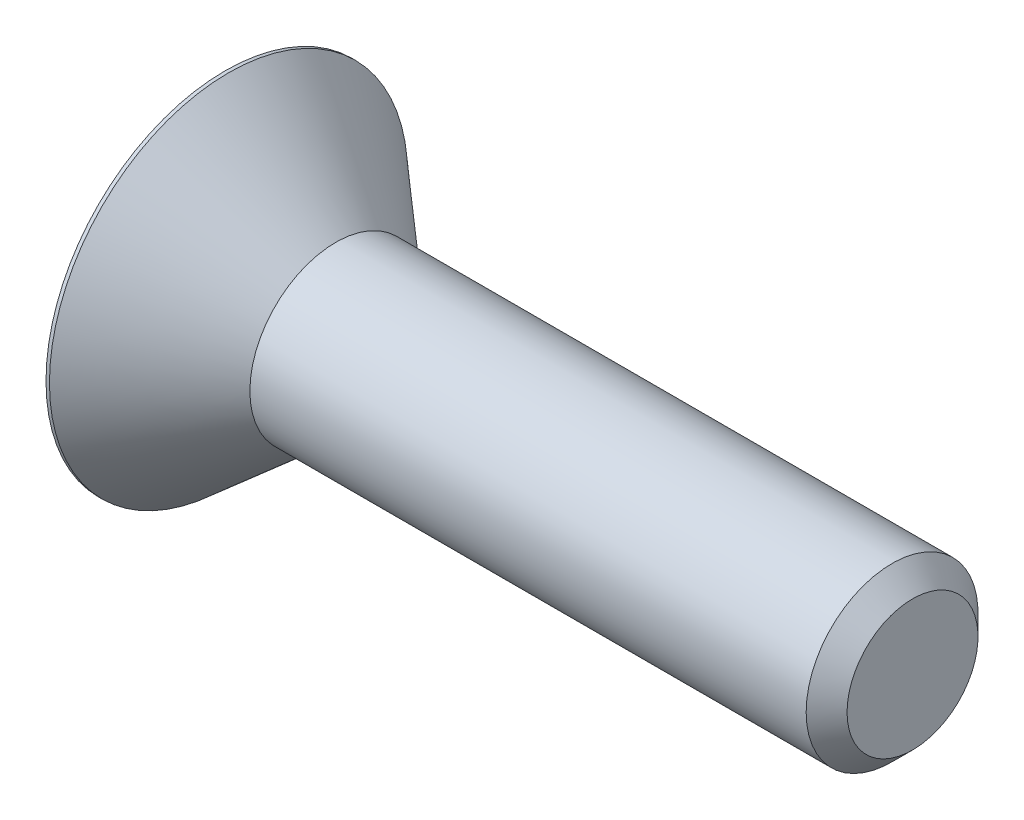
ISO-10303-21;
HEADER;
FILE_DESCRIPTION(('STEP AP214'),'2;1');
FILE_NAME('part.step','',(''),(''),'','','');
FILE_SCHEMA(('AUTOMOTIVE_DESIGN { 1 0 10303 214 1 1 1 1 }'));
ENDSEC;
DATA;
#1=APPLICATION_CONTEXT('core data for automotive mechanical design processes');
#2=APPLICATION_PROTOCOL_DEFINITION('international standard','automotive_design',2000,#1);
#3=PRODUCT_CONTEXT('',#1,'mechanical');
#4=PRODUCT('Part','Part','',(#3));
#5=PRODUCT_RELATED_PRODUCT_CATEGORY('part','',(#4));
#6=PRODUCT_DEFINITION_FORMATION('','',#4);
#7=PRODUCT_DEFINITION_CONTEXT('part definition',#1,'design');
#8=PRODUCT_DEFINITION('design','',#6,#7);
#9=PRODUCT_DEFINITION_SHAPE('','',#8);
#10=(LENGTH_UNIT() NAMED_UNIT(*) SI_UNIT(.MILLI.,.METRE.));
#11=(NAMED_UNIT(*) PLANE_ANGLE_UNIT() SI_UNIT($,.RADIAN.));
#12=(NAMED_UNIT(*) SI_UNIT($,.STERADIAN.) SOLID_ANGLE_UNIT());
#13=UNCERTAINTY_MEASURE_WITH_UNIT(LENGTH_MEASURE(1.E-05),#10,'distance_accuracy_value','');
#14=(GEOMETRIC_REPRESENTATION_CONTEXT(3) GLOBAL_UNCERTAINTY_ASSIGNED_CONTEXT((#13)) GLOBAL_UNIT_ASSIGNED_CONTEXT((#10,
#11,#12)) REPRESENTATION_CONTEXT('',''));
#15=CARTESIAN_POINT('',(0.,0.,0.));
#16=DIRECTION('',(0.,0.,1.));
#17=DIRECTION('',(1.,0.,0.));
#18=AXIS2_PLACEMENT_3D('',#15,#16,#17);
#19=CARTESIAN_POINT('',(0.,0.,0.));
#20=DIRECTION('',(-1.,0.,0.));
#21=DIRECTION('',(0.,0.,1.));
#22=AXIS2_PLACEMENT_3D('',#19,#20,#21);
#23=PLANE('',#22);
#24=CARTESIAN_POINT('',(0.,0.,0.));
#25=DIRECTION('',(-1.,0.,0.));
#26=DIRECTION('',(0.,0.,1.));
#27=AXIS2_PLACEMENT_3D('',#24,#25,#26);
#28=CIRCLE('',#27,6.61924);
#29=CARTESIAN_POINT('',(0.,0.,6.61924));
#30=VERTEX_POINT('',#29);
#31=EDGE_CURVE('E10',#30,#30,#28,.T.);
#32=ORIENTED_EDGE('',*,*,#31,.T.);
#33=EDGE_LOOP('',(#32));
#34=FACE_BOUND('',#33,.T.);
#35=ADVANCED_FACE('F34',(#34),#23,.T.);
#36=CARTESIAN_POINT('',(0.,0.,0.));
#37=DIRECTION('',(-1.,0.,0.));
#38=DIRECTION('',(0.,0.,1.));
#39=AXIS2_PLACEMENT_3D('',#36,#37,#38);
#40=CYLINDRICAL_SURFACE('',#39,6.61924);
#41=CARTESIAN_POINT('',(0.127,0.,0.));
#42=DIRECTION('',(-1.,0.,0.));
#43=DIRECTION('',(0.,0.,1.));
#44=AXIS2_PLACEMENT_3D('',#41,#42,#43);
#45=CIRCLE('',#44,6.61924);
#46=CARTESIAN_POINT('',(0.127,0.,6.61924));
#47=VERTEX_POINT('',#46);
#48=EDGE_CURVE('E40',#47,#47,#45,.T.);
#49=ORIENTED_EDGE('',*,*,#48,.T.);
#50=EDGE_LOOP('',(#49));
#51=FACE_BOUND('',#50,.T.);
#52=ORIENTED_EDGE('',*,*,#31,.F.);
#53=EDGE_LOOP('',(#52));
#54=FACE_BOUND('',#53,.T.);
#55=ADVANCED_FACE('F69',(#51,#54),#40,.T.);
#56=CARTESIAN_POINT('',(0.127,0.,0.));
#57=DIRECTION('',(-1.,0.,0.));
#58=DIRECTION('',(0.,0.,1.));
#59=AXIS2_PLACEMENT_3D('',#56,#57,#58);
#60=CONICAL_SURFACE('',#59,6.61924,0.715584993317678);
#61=CARTESIAN_POINT('',(4.08914488288686,0.,0.));
#62=DIRECTION('',(-1.,0.,0.));
#63=DIRECTION('',(0.,0.,1.));
#64=AXIS2_PLACEMENT_3D('',#61,#62,#63);
#65=CIRCLE('',#64,3.175);
#66=CARTESIAN_POINT('',(4.08914488288686,0.,3.175));
#67=VERTEX_POINT('',#66);
#68=EDGE_CURVE('E44',#67,#67,#65,.T.);
#69=ORIENTED_EDGE('',*,*,#68,.T.);
#70=EDGE_LOOP('',(#69));
#71=FACE_BOUND('',#70,.T.);
#72=ORIENTED_EDGE('',*,*,#48,.F.);
#73=EDGE_LOOP('',(#72));
#74=FACE_BOUND('',#73,.T.);
#75=ADVANCED_FACE('F73',(#71,#74),#60,.T.);
#76=CARTESIAN_POINT('',(0.,0.,0.));
#77=DIRECTION('',(-1.,0.,0.));
#78=DIRECTION('',(0.,0.,1.));
#79=AXIS2_PLACEMENT_3D('',#76,#77,#78);
#80=CYLINDRICAL_SURFACE('',#79,3.175);
#81=CARTESIAN_POINT('',(24.64435,0.,0.));
#82=DIRECTION('',(-1.,0.,0.));
#83=DIRECTION('',(0.,0.,1.));
#84=AXIS2_PLACEMENT_3D('',#81,#82,#83);
#85=CIRCLE('',#84,3.175);
#86=CARTESIAN_POINT('',(24.64435,0.,3.175));
#87=VERTEX_POINT('',#86);
#88=EDGE_CURVE('E48',#87,#87,#85,.T.);
#89=ORIENTED_EDGE('',*,*,#88,.T.);
#90=EDGE_LOOP('',(#89));
#91=FACE_BOUND('',#90,.T.);
#92=ORIENTED_EDGE('',*,*,#68,.F.);
#93=EDGE_LOOP('',(#92));
#94=FACE_BOUND('',#93,.T.);
#95=ADVANCED_FACE('F65',(#91,#94),#80,.T.);
#96=CARTESIAN_POINT('',(25.4,0.,0.));
#97=DIRECTION('',(-1.,0.,0.));
#98=DIRECTION('',(0.,0.,1.));
#99=AXIS2_PLACEMENT_3D('',#96,#97,#98);
#100=CONICAL_SURFACE('',#99,2.41935,0.785398163397442);
#101=ORIENTED_EDGE('',*,*,#88,.F.);
#102=EDGE_LOOP('',(#101));
#103=FACE_BOUND('',#102,.T.);
#104=CARTESIAN_POINT('',(25.4,0.,0.));
#105=DIRECTION('',(-1.,0.,0.));
#106=DIRECTION('',(0.,0.,1.));
#107=AXIS2_PLACEMENT_3D('',#104,#105,#106);
#108=CIRCLE('',#107,2.41935);
#109=CARTESIAN_POINT('',(25.4,0.,2.41935));
#110=VERTEX_POINT('',#109);
#111=EDGE_CURVE('E53',#110,#110,#108,.T.);
#112=ORIENTED_EDGE('',*,*,#111,.T.);
#113=EDGE_LOOP('',(#112));
#114=FACE_BOUND('',#113,.T.);
#115=ADVANCED_FACE('F57',(#103,#114),#100,.T.);
#116=CARTESIAN_POINT('',(25.4,2.41935,0.));
#117=DIRECTION('',(1.,0.,0.));
#118=DIRECTION('',(0.,0.,-1.));
#119=AXIS2_PLACEMENT_3D('',#116,#117,#118);
#120=PLANE('',#119);
#121=ORIENTED_EDGE('',*,*,#111,.F.);
#122=EDGE_LOOP('',(#121));
#123=FACE_BOUND('',#122,.T.);
#124=ADVANCED_FACE('F59',(#123),#120,.T.);
#125=CLOSED_SHELL('',(#35,#55,#75,#95,#115,#124));
#126=MANIFOLD_SOLID_BREP('B2',#125);
#127=ADVANCED_BREP_SHAPE_REPRESENTATION('',(#18,#126),#14);
#128=SHAPE_DEFINITION_REPRESENTATION(#9,#127);
ENDSEC;
END-ISO-10303-21;
